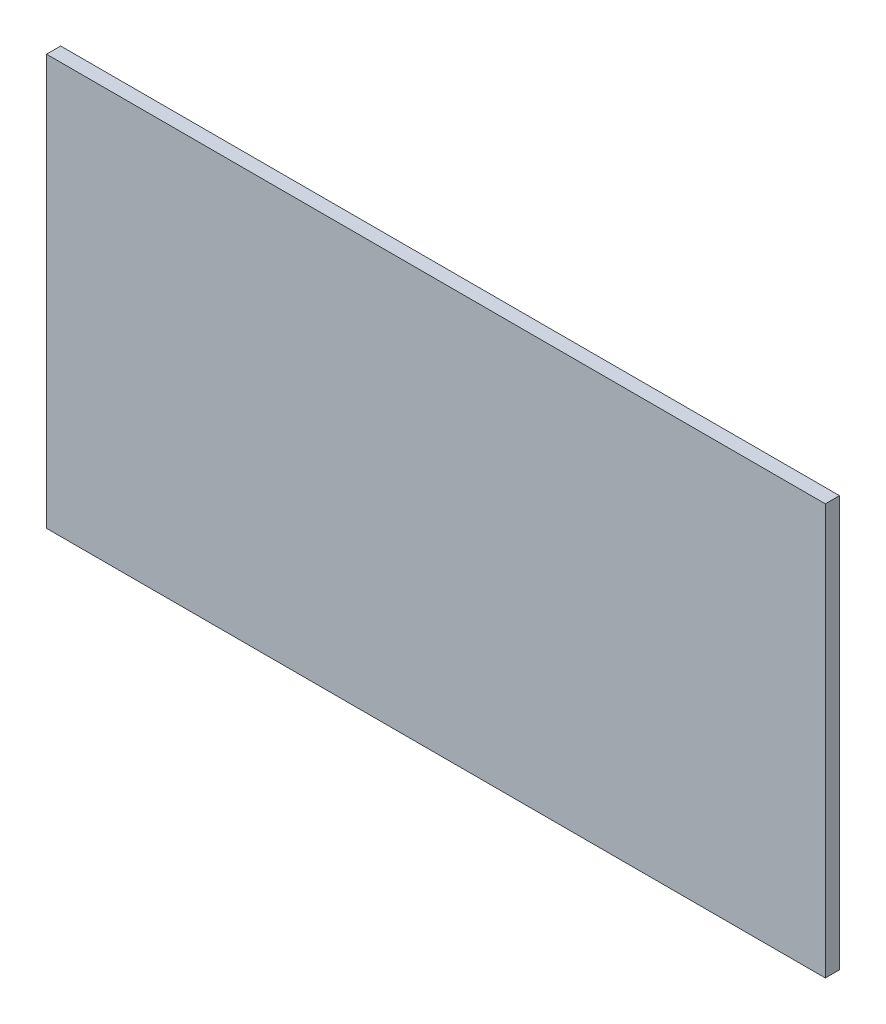
ISO-10303-21;
HEADER;
FILE_DESCRIPTION(('STEP AP214'),'2;1');
FILE_NAME('part.step','',(''),(''),'','','');
FILE_SCHEMA(('AUTOMOTIVE_DESIGN { 1 0 10303 214 1 1 1 1 }'));
ENDSEC;
DATA;
#1=APPLICATION_CONTEXT('core data for automotive mechanical design processes');
#2=APPLICATION_PROTOCOL_DEFINITION('international standard','automotive_design',2000,#1);
#3=PRODUCT_CONTEXT('',#1,'mechanical');
#4=PRODUCT('Part','Part','',(#3));
#5=PRODUCT_RELATED_PRODUCT_CATEGORY('part','',(#4));
#6=PRODUCT_DEFINITION_FORMATION('','',#4);
#7=PRODUCT_DEFINITION_CONTEXT('part definition',#1,'design');
#8=PRODUCT_DEFINITION('design','',#6,#7);
#9=PRODUCT_DEFINITION_SHAPE('','',#8);
#10=(LENGTH_UNIT() NAMED_UNIT(*) SI_UNIT(.MILLI.,.METRE.));
#11=(NAMED_UNIT(*) PLANE_ANGLE_UNIT() SI_UNIT($,.RADIAN.));
#12=(NAMED_UNIT(*) SI_UNIT($,.STERADIAN.) SOLID_ANGLE_UNIT());
#13=UNCERTAINTY_MEASURE_WITH_UNIT(LENGTH_MEASURE(1.E-05),#10,'distance_accuracy_value','');
#14=(GEOMETRIC_REPRESENTATION_CONTEXT(3) GLOBAL_UNCERTAINTY_ASSIGNED_CONTEXT((#13)) GLOBAL_UNIT_ASSIGNED_CONTEXT((#10,
#11,#12)) REPRESENTATION_CONTEXT('',''));
#15=CARTESIAN_POINT('',(0.,0.,0.));
#16=DIRECTION('',(0.,0.,1.));
#17=DIRECTION('',(1.,0.,0.));
#18=AXIS2_PLACEMENT_3D('',#15,#16,#17);
#19=CARTESIAN_POINT('',(0.,0.,6.));
#20=DIRECTION('',(-1.,0.,0.));
#21=DIRECTION('',(0.,0.,1.));
#22=AXIS2_PLACEMENT_3D('',#19,#20,#21);
#23=PLANE('',#22);
#24=DIRECTION('',(0.,1.,0.));
#25=VECTOR('',#24,1.);
#26=CARTESIAN_POINT('',(0.,0.,0.));
#27=LINE('',#26,#25);
#28=CARTESIAN_POINT('',(0.,0.,0.));
#29=VERTEX_POINT('',#28);
#30=CARTESIAN_POINT('',(0.,174.,0.));
#31=VERTEX_POINT('',#30);
#32=EDGE_CURVE('E96',#29,#31,#27,.T.);
#33=ORIENTED_EDGE('',*,*,#32,.T.);
#34=DIRECTION('',(0.,0.,-1.));
#35=VECTOR('',#34,1.);
#36=CARTESIAN_POINT('',(0.,174.,6.));
#37=LINE('',#36,#35);
#38=CARTESIAN_POINT('',(0.,174.,6.));
#39=VERTEX_POINT('',#38);
#40=EDGE_CURVE('E11',#39,#31,#37,.T.);
#41=ORIENTED_EDGE('',*,*,#40,.F.);
#42=DIRECTION('',(0.,1.,0.));
#43=VECTOR('',#42,1.);
#44=CARTESIAN_POINT('',(0.,0.,6.));
#45=LINE('',#44,#43);
#46=CARTESIAN_POINT('',(0.,0.,6.));
#47=VERTEX_POINT('',#46);
#48=EDGE_CURVE('E84',#47,#39,#45,.T.);
#49=ORIENTED_EDGE('',*,*,#48,.F.);
#50=DIRECTION('',(0.,0.,-1.));
#51=VECTOR('',#50,1.);
#52=CARTESIAN_POINT('',(0.,0.,6.));
#53=LINE('',#52,#51);
#54=EDGE_CURVE('E92',#47,#29,#53,.T.);
#55=ORIENTED_EDGE('',*,*,#54,.T.);
#56=EDGE_LOOP('',(#33,#41,#49,#55));
#57=FACE_BOUND('',#56,.T.);
#58=ADVANCED_FACE('F33',(#57),#23,.F.);
#59=CARTESIAN_POINT('',(0.,174.,6.));
#60=DIRECTION('',(0.,-1.,0.));
#61=DIRECTION('',(1.,0.,0.));
#62=AXIS2_PLACEMENT_3D('',#59,#60,#61);
#63=PLANE('',#62);
#64=DIRECTION('',(-1.,0.,0.));
#65=VECTOR('',#64,1.);
#66=CARTESIAN_POINT('',(0.,174.,0.));
#67=LINE('',#66,#65);
#68=CARTESIAN_POINT('',(-330.,174.,0.));
#69=VERTEX_POINT('',#68);
#70=EDGE_CURVE('E88',#31,#69,#67,.T.);
#71=ORIENTED_EDGE('',*,*,#70,.T.);
#72=DIRECTION('',(0.,0.,-1.));
#73=VECTOR('',#72,1.);
#74=CARTESIAN_POINT('',(-330.,174.,6.));
#75=LINE('',#74,#73);
#76=CARTESIAN_POINT('',(-330.,174.,6.));
#77=VERTEX_POINT('',#76);
#78=EDGE_CURVE('E41',#77,#69,#75,.T.);
#79=ORIENTED_EDGE('',*,*,#78,.F.);
#80=DIRECTION('',(-1.,0.,0.));
#81=VECTOR('',#80,1.);
#82=CARTESIAN_POINT('',(0.,174.,6.));
#83=LINE('',#82,#81);
#84=EDGE_CURVE('E79',#39,#77,#83,.T.);
#85=ORIENTED_EDGE('',*,*,#84,.F.);
#86=ORIENTED_EDGE('',*,*,#40,.T.);
#87=EDGE_LOOP('',(#71,#79,#85,#86));
#88=FACE_BOUND('',#87,.T.);
#89=ADVANCED_FACE('F87',(#88),#63,.F.);
#90=CARTESIAN_POINT('',(-330.,0.,6.));
#91=DIRECTION('',(1.,0.,0.));
#92=DIRECTION('',(0.,0.,-1.));
#93=AXIS2_PLACEMENT_3D('',#90,#91,#92);
#94=PLANE('',#93);
#95=DIRECTION('',(0.,-1.,0.));
#96=VECTOR('',#95,1.);
#97=CARTESIAN_POINT('',(-330.,0.,0.));
#98=LINE('',#97,#96);
#99=CARTESIAN_POINT('',(-330.,0.,0.));
#100=VERTEX_POINT('',#99);
#101=EDGE_CURVE('E66',#69,#100,#98,.T.);
#102=ORIENTED_EDGE('',*,*,#101,.T.);
#103=DIRECTION('',(0.,0.,-1.));
#104=VECTOR('',#103,1.);
#105=CARTESIAN_POINT('',(-330.,0.,6.));
#106=LINE('',#105,#104);
#107=CARTESIAN_POINT('',(-330.,0.,6.));
#108=VERTEX_POINT('',#107);
#109=EDGE_CURVE('E89',#108,#100,#106,.T.);
#110=ORIENTED_EDGE('',*,*,#109,.F.);
#111=DIRECTION('',(0.,-1.,0.));
#112=VECTOR('',#111,1.);
#113=CARTESIAN_POINT('',(-330.,0.,6.));
#114=LINE('',#113,#112);
#115=EDGE_CURVE('E82',#77,#108,#114,.T.);
#116=ORIENTED_EDGE('',*,*,#115,.F.);
#117=ORIENTED_EDGE('',*,*,#78,.T.);
#118=EDGE_LOOP('',(#102,#110,#116,#117));
#119=FACE_BOUND('',#118,.T.);
#120=ADVANCED_FACE('F90',(#119),#94,.F.);
#121=CARTESIAN_POINT('',(0.,0.,6.));
#122=DIRECTION('',(0.,1.,0.));
#123=DIRECTION('',(-1.,0.,0.));
#124=AXIS2_PLACEMENT_3D('',#121,#122,#123);
#125=PLANE('',#124);
#126=DIRECTION('',(1.,0.,0.));
#127=VECTOR('',#126,1.);
#128=CARTESIAN_POINT('',(0.,0.,0.));
#129=LINE('',#128,#127);
#130=EDGE_CURVE('E72',#100,#29,#129,.T.);
#131=ORIENTED_EDGE('',*,*,#130,.T.);
#132=ORIENTED_EDGE('',*,*,#54,.F.);
#133=DIRECTION('',(1.,0.,0.));
#134=VECTOR('',#133,1.);
#135=CARTESIAN_POINT('',(0.,0.,6.));
#136=LINE('',#135,#134);
#137=EDGE_CURVE('E49',#108,#47,#136,.T.);
#138=ORIENTED_EDGE('',*,*,#137,.F.);
#139=ORIENTED_EDGE('',*,*,#109,.T.);
#140=EDGE_LOOP('',(#131,#132,#138,#139));
#141=FACE_BOUND('',#140,.T.);
#142=ADVANCED_FACE('F103',(#141),#125,.F.);
#143=CARTESIAN_POINT('',(0.,0.,6.));
#144=DIRECTION('',(0.,0.,1.));
#145=DIRECTION('',(1.,0.,0.));
#146=AXIS2_PLACEMENT_3D('',#143,#144,#145);
#147=PLANE('',#146);
#148=ORIENTED_EDGE('',*,*,#48,.T.);
#149=ORIENTED_EDGE('',*,*,#84,.T.);
#150=ORIENTED_EDGE('',*,*,#115,.T.);
#151=ORIENTED_EDGE('',*,*,#137,.T.);
#152=EDGE_LOOP('',(#148,#149,#150,#151));
#153=FACE_BOUND('',#152,.T.);
#154=ADVANCED_FACE('F80',(#153),#147,.T.);
#155=CARTESIAN_POINT('',(0.,0.,0.));
#156=DIRECTION('',(0.,0.,1.));
#157=DIRECTION('',(1.,0.,0.));
#158=AXIS2_PLACEMENT_3D('',#155,#156,#157);
#159=PLANE('',#158);
#160=ORIENTED_EDGE('',*,*,#32,.F.);
#161=ORIENTED_EDGE('',*,*,#130,.F.);
#162=ORIENTED_EDGE('',*,*,#101,.F.);
#163=ORIENTED_EDGE('',*,*,#70,.F.);
#164=EDGE_LOOP('',(#160,#161,#162,#163));
#165=FACE_BOUND('',#164,.T.);
#166=ADVANCED_FACE('F106',(#165),#159,.F.);
#167=CLOSED_SHELL('',(#58,#89,#120,#142,#154,#166));
#168=MANIFOLD_SOLID_BREP('B2',#167);
#169=ADVANCED_BREP_SHAPE_REPRESENTATION('',(#18,#168),#14);
#170=SHAPE_DEFINITION_REPRESENTATION(#9,#169);
ENDSEC;
END-ISO-10303-21;
